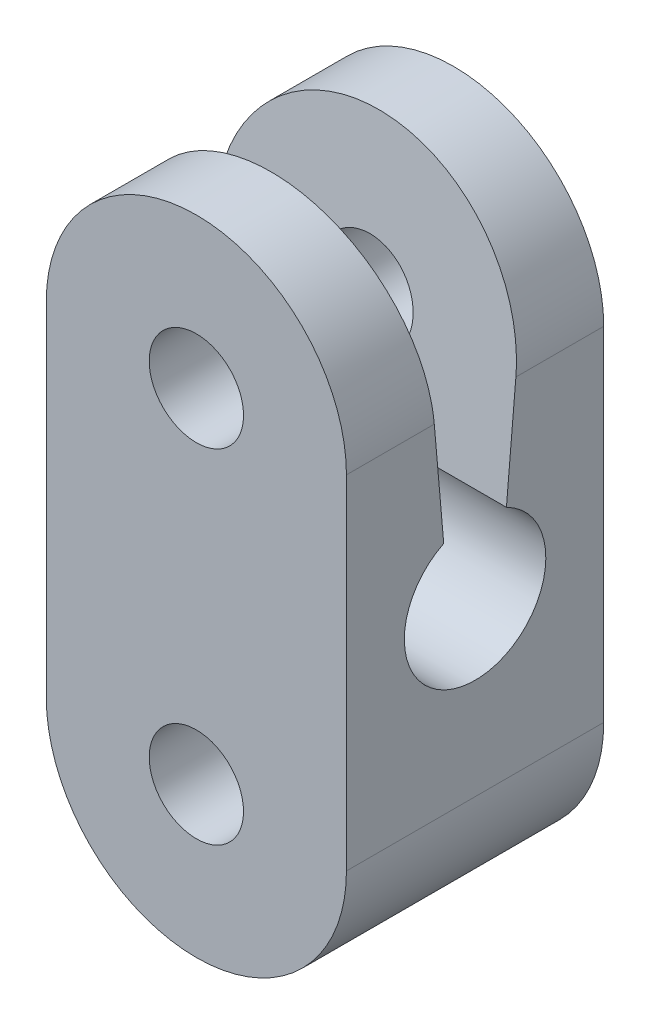
ISO-10303-21;
HEADER;
FILE_DESCRIPTION(('STEP AP214'),'2;1');
FILE_NAME('part.step','',(''),(''),'','','');
FILE_SCHEMA(('AUTOMOTIVE_DESIGN { 1 0 10303 214 1 1 1 1 }'));
ENDSEC;
DATA;
#1=APPLICATION_CONTEXT('core data for automotive mechanical design processes');
#2=APPLICATION_PROTOCOL_DEFINITION('international standard','automotive_design',2000,#1);
#3=PRODUCT_CONTEXT('',#1,'mechanical');
#4=PRODUCT('Part','Part','',(#3));
#5=PRODUCT_RELATED_PRODUCT_CATEGORY('part','',(#4));
#6=PRODUCT_DEFINITION_FORMATION('','',#4);
#7=PRODUCT_DEFINITION_CONTEXT('part definition',#1,'design');
#8=PRODUCT_DEFINITION('design','',#6,#7);
#9=PRODUCT_DEFINITION_SHAPE('','',#8);
#10=(LENGTH_UNIT() NAMED_UNIT(*) SI_UNIT(.MILLI.,.METRE.));
#11=(NAMED_UNIT(*) PLANE_ANGLE_UNIT() SI_UNIT($,.RADIAN.));
#12=(NAMED_UNIT(*) SI_UNIT($,.STERADIAN.) SOLID_ANGLE_UNIT());
#13=UNCERTAINTY_MEASURE_WITH_UNIT(LENGTH_MEASURE(1.E-05),#10,'distance_accuracy_value','');
#14=(GEOMETRIC_REPRESENTATION_CONTEXT(3) GLOBAL_UNCERTAINTY_ASSIGNED_CONTEXT((#13)) GLOBAL_UNIT_ASSIGNED_CONTEXT((#10,
#11,#12)) REPRESENTATION_CONTEXT('',''));
#15=CARTESIAN_POINT('',(0.,0.,0.));
#16=DIRECTION('',(0.,0.,1.));
#17=DIRECTION('',(1.,0.,0.));
#18=AXIS2_PLACEMENT_3D('',#15,#16,#17);
#19=CARTESIAN_POINT('',(0.,4.,3.));
#20=DIRECTION('',(0.,0.,-1.));
#21=DIRECTION('',(-1.,0.,0.));
#22=AXIS2_PLACEMENT_3D('',#19,#20,#21);
#23=CYLINDRICAL_SURFACE('',#22,3.5);
#24=CARTESIAN_POINT('',(0.,4.,0.951517284810414));
#25=DIRECTION('',(0.,0.0871557427476583,-0.996194698091745));
#26=DIRECTION('',(0.,-0.996194698091746,-0.0871557427476584));
#27=AXIS2_PLACEMENT_3D('',#24,#25,#26);
#28=ELLIPSE('',#27,3.51336943140172,3.5);
#29=CARTESIAN_POINT('',(-3.5,4.,0.951517284810413));
#30=VERTEX_POINT('',#29);
#31=CARTESIAN_POINT('',(3.5,4.,0.951517284810414));
#32=VERTEX_POINT('',#31);
#33=EDGE_CURVE('E181',#30,#32,#28,.T.);
#34=ORIENTED_EDGE('',*,*,#33,.F.);
#35=DIRECTION('',(0.,0.,-1.));
#36=VECTOR('',#35,1.);
#37=CARTESIAN_POINT('',(-3.5,4.,3.));
#38=LINE('',#37,#36);
#39=CARTESIAN_POINT('',(-3.5,4.,3.));
#40=VERTEX_POINT('',#39);
#41=EDGE_CURVE('E203',#40,#30,#38,.T.);
#42=ORIENTED_EDGE('',*,*,#41,.F.);
#43=CARTESIAN_POINT('',(0.,4.,3.));
#44=DIRECTION('',(0.,0.,1.));
#45=DIRECTION('',(1.,0.,0.));
#46=AXIS2_PLACEMENT_3D('',#43,#44,#45);
#47=CIRCLE('',#46,3.5);
#48=CARTESIAN_POINT('',(3.5,4.,3.));
#49=VERTEX_POINT('',#48);
#50=EDGE_CURVE('E189',#49,#40,#47,.T.);
#51=ORIENTED_EDGE('',*,*,#50,.F.);
#52=DIRECTION('',(0.,0.,-1.));
#53=VECTOR('',#52,1.);
#54=CARTESIAN_POINT('',(3.5,4.,3.));
#55=LINE('',#54,#53);
#56=EDGE_CURVE('E206',#49,#32,#55,.T.);
#57=ORIENTED_EDGE('',*,*,#56,.T.);
#58=EDGE_LOOP('',(#34,#42,#51,#57));
#59=FACE_BOUND('',#58,.T.);
#60=ADVANCED_FACE('F79',(#59),#23,.T.);
#61=CARTESIAN_POINT('',(0.,-4.,3.));
#62=DIRECTION('',(0.,0.,-1.));
#63=DIRECTION('',(-1.,0.,0.));
#64=AXIS2_PLACEMENT_3D('',#61,#62,#63);
#65=CYLINDRICAL_SURFACE('',#64,3.5);
#66=CARTESIAN_POINT('',(0.,-4.,-3.));
#67=DIRECTION('',(0.,0.,1.));
#68=DIRECTION('',(1.,0.,0.));
#69=AXIS2_PLACEMENT_3D('',#66,#67,#68);
#70=CIRCLE('',#69,3.5);
#71=CARTESIAN_POINT('',(-3.5,-4.,-3.));
#72=VERTEX_POINT('',#71);
#73=CARTESIAN_POINT('',(3.5,-4.,-3.));
#74=VERTEX_POINT('',#73);
#75=EDGE_CURVE('E185',#72,#74,#70,.T.);
#76=ORIENTED_EDGE('',*,*,#75,.T.);
#77=DIRECTION('',(0.,0.,-1.));
#78=VECTOR('',#77,1.);
#79=CARTESIAN_POINT('',(3.5,-4.,3.));
#80=LINE('',#79,#78);
#81=CARTESIAN_POINT('',(3.5,-4.,3.));
#82=VERTEX_POINT('',#81);
#83=EDGE_CURVE('E209',#82,#74,#80,.T.);
#84=ORIENTED_EDGE('',*,*,#83,.F.);
#85=CARTESIAN_POINT('',(0.,-4.,3.));
#86=DIRECTION('',(0.,0.,1.));
#87=DIRECTION('',(1.,0.,0.));
#88=AXIS2_PLACEMENT_3D('',#85,#86,#87);
#89=CIRCLE('',#88,3.5);
#90=CARTESIAN_POINT('',(-3.5,-4.,3.));
#91=VERTEX_POINT('',#90);
#92=EDGE_CURVE('E186',#91,#82,#89,.T.);
#93=ORIENTED_EDGE('',*,*,#92,.F.);
#94=DIRECTION('',(0.,0.,-1.));
#95=VECTOR('',#94,1.);
#96=CARTESIAN_POINT('',(-3.5,-4.,3.));
#97=LINE('',#96,#95);
#98=EDGE_CURVE('E192',#91,#72,#97,.T.);
#99=ORIENTED_EDGE('',*,*,#98,.T.);
#100=EDGE_LOOP('',(#76,#84,#93,#99));
#101=FACE_BOUND('',#100,.T.);
#102=ADVANCED_FACE('F81',(#101),#65,.T.);
#103=CARTESIAN_POINT('',(3.5,-4.,3.));
#104=DIRECTION('',(-1.,0.,0.));
#105=DIRECTION('',(0.,-1.,0.));
#106=AXIS2_PLACEMENT_3D('',#103,#104,#105);
#107=PLANE('',#106);
#108=CARTESIAN_POINT('',(3.5,4.,-0.951517284810414));
#109=VERTEX_POINT('',#108);
#110=CARTESIAN_POINT('',(3.5,4.,-3.));
#111=VERTEX_POINT('',#110);
#112=EDGE_CURVE('E172',#109,#111,#55,.T.);
#113=ORIENTED_EDGE('',*,*,#112,.F.);
#114=DIRECTION('',(0.,0.996194698091746,-0.0871557427476584));
#115=VECTOR('',#114,1.);
#116=CARTESIAN_POINT('',(3.5,-0.0522301272873727,-0.596993086674556));
#117=LINE('',#116,#115);
#118=CARTESIAN_POINT('',(3.5,1.47924589546018,-0.730979877126737));
#119=VERTEX_POINT('',#118);
#120=EDGE_CURVE('E158',#119,#109,#117,.T.);
#121=ORIENTED_EDGE('',*,*,#120,.F.);
#122=CARTESIAN_POINT('',(3.5,0.,0.));
#123=DIRECTION('',(1.,0.,0.));
#124=DIRECTION('',(0.,1.,0.));
#125=AXIS2_PLACEMENT_3D('',#122,#123,#124);
#126=CIRCLE('',#125,1.65);
#127=CARTESIAN_POINT('',(3.5,1.47924589546018,0.730979877126737));
#128=VERTEX_POINT('',#127);
#129=EDGE_CURVE('E162',#128,#119,#126,.T.);
#130=ORIENTED_EDGE('',*,*,#129,.F.);
#131=DIRECTION('',(0.,0.996194698091746,0.0871557427476584));
#132=VECTOR('',#131,1.);
#133=CARTESIAN_POINT('',(3.5,-0.0522301272873727,0.596993086674556));
#134=LINE('',#133,#132);
#135=EDGE_CURVE('E167',#128,#32,#134,.T.);
#136=ORIENTED_EDGE('',*,*,#135,.T.);
#137=ORIENTED_EDGE('',*,*,#56,.F.);
#138=DIRECTION('',(0.,1.,0.));
#139=VECTOR('',#138,1.);
#140=CARTESIAN_POINT('',(3.5,-4.,3.));
#141=LINE('',#140,#139);
#142=EDGE_CURVE('E133',#82,#49,#141,.T.);
#143=ORIENTED_EDGE('',*,*,#142,.F.);
#144=ORIENTED_EDGE('',*,*,#83,.T.);
#145=DIRECTION('',(0.,1.,0.));
#146=VECTOR('',#145,1.);
#147=CARTESIAN_POINT('',(3.5,-4.,-3.));
#148=LINE('',#147,#146);
#149=EDGE_CURVE('E195',#74,#111,#148,.T.);
#150=ORIENTED_EDGE('',*,*,#149,.T.);
#151=EDGE_LOOP('',(#113,#121,#130,#136,#137,#143,#144,#150));
#152=FACE_BOUND('',#151,.T.);
#153=ADVANCED_FACE('F170',(#152),#107,.F.);
#154=CARTESIAN_POINT('',(-3.5,4.,-0.951517284810414));
#155=VERTEX_POINT('',#154);
#156=CARTESIAN_POINT('',(-3.5,4.,-3.));
#157=VERTEX_POINT('',#156);
#158=EDGE_CURVE('E202',#155,#157,#38,.T.);
#159=ORIENTED_EDGE('',*,*,#158,.F.);
#160=CARTESIAN_POINT('',(0.,4.,-0.951517284810414));
#161=DIRECTION('',(0.,-0.0871557427476583,-0.996194698091745));
#162=DIRECTION('',(0.,0.996194698091746,-0.0871557427476584));
#163=AXIS2_PLACEMENT_3D('',#160,#161,#162);
#164=ELLIPSE('',#163,3.51336943140172,3.5);
#165=EDGE_CURVE('E183',#155,#109,#164,.T.);
#166=ORIENTED_EDGE('',*,*,#165,.T.);
#167=ORIENTED_EDGE('',*,*,#112,.T.);
#168=CARTESIAN_POINT('',(0.,4.,-3.));
#169=DIRECTION('',(0.,0.,1.));
#170=DIRECTION('',(1.,0.,0.));
#171=AXIS2_PLACEMENT_3D('',#168,#169,#170);
#172=CIRCLE('',#171,3.5);
#173=EDGE_CURVE('E197',#111,#157,#172,.T.);
#174=ORIENTED_EDGE('',*,*,#173,.T.);
#175=EDGE_LOOP('',(#159,#166,#167,#174));
#176=FACE_BOUND('',#175,.T.);
#177=ADVANCED_FACE('F247',(#176),#23,.T.);
#178=CARTESIAN_POINT('',(-3.5,-4.,3.));
#179=DIRECTION('',(1.,0.,0.));
#180=DIRECTION('',(0.,1.,0.));
#181=AXIS2_PLACEMENT_3D('',#178,#179,#180);
#182=PLANE('',#181);
#183=CARTESIAN_POINT('',(-3.5,0.,0.));
#184=DIRECTION('',(1.,0.,0.));
#185=DIRECTION('',(0.,1.,0.));
#186=AXIS2_PLACEMENT_3D('',#183,#184,#185);
#187=CIRCLE('',#186,1.65);
#188=CARTESIAN_POINT('',(-3.5,1.47924589546018,0.730979877126736));
#189=VERTEX_POINT('',#188);
#190=CARTESIAN_POINT('',(-3.5,1.47924589546018,-0.730979877126737));
#191=VERTEX_POINT('',#190);
#192=EDGE_CURVE('E88',#189,#191,#187,.T.);
#193=ORIENTED_EDGE('',*,*,#192,.T.);
#194=DIRECTION('',(0.,0.996194698091746,-0.0871557427476584));
#195=VECTOR('',#194,1.);
#196=CARTESIAN_POINT('',(-3.5,-4.28231789981219,-0.226908360859006));
#197=LINE('',#196,#195);
#198=EDGE_CURVE('E12',#191,#155,#197,.T.);
#199=ORIENTED_EDGE('',*,*,#198,.T.);
#200=ORIENTED_EDGE('',*,*,#158,.T.);
#201=DIRECTION('',(0.,-1.,0.));
#202=VECTOR('',#201,1.);
#203=CARTESIAN_POINT('',(-3.5,-4.,-3.));
#204=LINE('',#203,#202);
#205=EDGE_CURVE('E125',#157,#72,#204,.T.);
#206=ORIENTED_EDGE('',*,*,#205,.T.);
#207=ORIENTED_EDGE('',*,*,#98,.F.);
#208=DIRECTION('',(0.,-1.,0.));
#209=VECTOR('',#208,1.);
#210=CARTESIAN_POINT('',(-3.5,-4.,3.));
#211=LINE('',#210,#209);
#212=EDGE_CURVE('E105',#40,#91,#211,.T.);
#213=ORIENTED_EDGE('',*,*,#212,.F.);
#214=ORIENTED_EDGE('',*,*,#41,.T.);
#215=DIRECTION('',(0.,0.996194698091746,0.0871557427476584));
#216=VECTOR('',#215,1.);
#217=CARTESIAN_POINT('',(-3.5,-3.76137336681139,0.272485101822382));
#218=LINE('',#217,#216);
#219=EDGE_CURVE('E211',#189,#30,#218,.T.);
#220=ORIENTED_EDGE('',*,*,#219,.F.);
#221=EDGE_LOOP('',(#193,#199,#200,#206,#207,#213,#214,#220));
#222=FACE_BOUND('',#221,.T.);
#223=ADVANCED_FACE('F237',(#222),#182,.F.);
#224=CARTESIAN_POINT('',(0.,-4.,3.));
#225=DIRECTION('',(0.,0.,1.));
#226=DIRECTION('',(1.,0.,0.));
#227=AXIS2_PLACEMENT_3D('',#224,#225,#226);
#228=PLANE('',#227);
#229=CARTESIAN_POINT('',(0.,-4.,3.));
#230=DIRECTION('',(0.,0.,1.));
#231=DIRECTION('',(1.,0.,0.));
#232=AXIS2_PLACEMENT_3D('',#229,#230,#231);
#233=CIRCLE('',#232,1.1);
#234=CARTESIAN_POINT('',(1.1,-4.,3.));
#235=VERTEX_POINT('',#234);
#236=EDGE_CURVE('E225',#235,#235,#233,.T.);
#237=ORIENTED_EDGE('',*,*,#236,.F.);
#238=EDGE_LOOP('',(#237));
#239=FACE_BOUND('',#238,.T.);
#240=CARTESIAN_POINT('',(0.,4.,3.));
#241=DIRECTION('',(0.,0.,1.));
#242=DIRECTION('',(1.,0.,0.));
#243=AXIS2_PLACEMENT_3D('',#240,#241,#242);
#244=CIRCLE('',#243,1.1);
#245=CARTESIAN_POINT('',(1.1,4.,3.));
#246=VERTEX_POINT('',#245);
#247=EDGE_CURVE('E215',#246,#246,#244,.T.);
#248=ORIENTED_EDGE('',*,*,#247,.F.);
#249=EDGE_LOOP('',(#248));
#250=FACE_BOUND('',#249,.T.);
#251=ORIENTED_EDGE('',*,*,#92,.T.);
#252=ORIENTED_EDGE('',*,*,#142,.T.);
#253=ORIENTED_EDGE('',*,*,#50,.T.);
#254=ORIENTED_EDGE('',*,*,#212,.T.);
#255=EDGE_LOOP('',(#251,#252,#253,#254));
#256=FACE_BOUND('',#255,.T.);
#257=ADVANCED_FACE('F233',(#239,#250,#256),#228,.T.);
#258=CARTESIAN_POINT('',(0.,-4.,-3.));
#259=DIRECTION('',(0.,0.,1.));
#260=DIRECTION('',(1.,0.,0.));
#261=AXIS2_PLACEMENT_3D('',#258,#259,#260);
#262=PLANE('',#261);
#263=CARTESIAN_POINT('',(0.,-4.,-3.));
#264=DIRECTION('',(0.,0.,1.));
#265=DIRECTION('',(1.,0.,0.));
#266=AXIS2_PLACEMENT_3D('',#263,#264,#265);
#267=CIRCLE('',#266,1.1);
#268=CARTESIAN_POINT('',(1.1,-4.,-3.));
#269=VERTEX_POINT('',#268);
#270=EDGE_CURVE('E83',#269,#269,#267,.T.);
#271=ORIENTED_EDGE('',*,*,#270,.T.);
#272=EDGE_LOOP('',(#271));
#273=FACE_BOUND('',#272,.T.);
#274=CARTESIAN_POINT('',(0.,4.,-3.));
#275=DIRECTION('',(0.,0.,1.));
#276=DIRECTION('',(1.,0.,0.));
#277=AXIS2_PLACEMENT_3D('',#274,#275,#276);
#278=CIRCLE('',#277,1.1);
#279=CARTESIAN_POINT('',(1.1,4.,-3.));
#280=VERTEX_POINT('',#279);
#281=EDGE_CURVE('E173',#280,#280,#278,.T.);
#282=ORIENTED_EDGE('',*,*,#281,.T.);
#283=EDGE_LOOP('',(#282));
#284=FACE_BOUND('',#283,.T.);
#285=ORIENTED_EDGE('',*,*,#75,.F.);
#286=ORIENTED_EDGE('',*,*,#205,.F.);
#287=ORIENTED_EDGE('',*,*,#173,.F.);
#288=ORIENTED_EDGE('',*,*,#149,.F.);
#289=EDGE_LOOP('',(#285,#286,#287,#288));
#290=FACE_BOUND('',#289,.T.);
#291=ADVANCED_FACE('F236',(#273,#284,#290),#262,.F.);
#292=CARTESIAN_POINT('',(-19.5,0.,0.));
#293=DIRECTION('',(1.,0.,0.));
#294=DIRECTION('',(0.,1.,0.));
#295=AXIS2_PLACEMENT_3D('',#292,#293,#294);
#296=CYLINDRICAL_SURFACE('',#295,1.65);
#297=DIRECTION('',(1.,0.,0.));
#298=VECTOR('',#297,1.);
#299=CARTESIAN_POINT('',(-19.5,1.47924589546017,0.730979877126737));
#300=LINE('',#299,#298);
#301=EDGE_CURVE('E96',#189,#128,#300,.T.);
#302=ORIENTED_EDGE('',*,*,#301,.T.);
#303=ORIENTED_EDGE('',*,*,#129,.T.);
#304=DIRECTION('',(1.,0.,0.));
#305=VECTOR('',#304,1.);
#306=CARTESIAN_POINT('',(-19.5,1.47924589546017,-0.730979877126737));
#307=LINE('',#306,#305);
#308=EDGE_CURVE('E154',#191,#119,#307,.T.);
#309=ORIENTED_EDGE('',*,*,#308,.F.);
#310=ORIENTED_EDGE('',*,*,#192,.F.);
#311=EDGE_LOOP('',(#302,#303,#309,#310));
#312=FACE_BOUND('',#311,.T.);
#313=ADVANCED_FACE('F165',(#312),#296,.F.);
#314=CARTESIAN_POINT('',(-19.5,-0.0522301272873757,-0.596993086674556));
#315=DIRECTION('',(0.,-0.0871557427476583,-0.996194698091745));
#316=DIRECTION('',(0.,0.996194698091746,-0.0871557427476584));
#317=AXIS2_PLACEMENT_3D('',#314,#315,#316);
#318=PLANE('',#317);
#319=CARTESIAN_POINT('',(0.,4.,-0.951517284810417));
#320=DIRECTION('',(0.,-0.0871557427476583,-0.996194698091745));
#321=DIRECTION('',(0.,-0.996194698091746,0.0871557427476584));
#322=AXIS2_PLACEMENT_3D('',#319,#320,#321);
#323=ELLIPSE('',#322,1.10420182129768,1.1);
#324=CARTESIAN_POINT('',(0.,2.9,-0.855279754931901));
#325=VERTEX_POINT('',#324);
#326=EDGE_CURVE('E177',#325,#325,#323,.T.);
#327=ORIENTED_EDGE('',*,*,#326,.T.);
#328=EDGE_LOOP('',(#327));
#329=FACE_BOUND('',#328,.T.);
#330=ORIENTED_EDGE('',*,*,#198,.F.);
#331=ORIENTED_EDGE('',*,*,#308,.T.);
#332=ORIENTED_EDGE('',*,*,#120,.T.);
#333=ORIENTED_EDGE('',*,*,#165,.F.);
#334=EDGE_LOOP('',(#330,#331,#332,#333));
#335=FACE_BOUND('',#334,.T.);
#336=ADVANCED_FACE('F156',(#329,#335),#318,.F.);
#337=CARTESIAN_POINT('',(-19.5,-0.0522301272873757,0.596993086674556));
#338=DIRECTION('',(0.,0.0871557427476583,-0.996194698091745));
#339=DIRECTION('',(0.,0.996194698091746,0.0871557427476584));
#340=AXIS2_PLACEMENT_3D('',#337,#338,#339);
#341=PLANE('',#340);
#342=CARTESIAN_POINT('',(0.,4.,0.951517284810414));
#343=DIRECTION('',(0.,0.0871557427476583,-0.996194698091745));
#344=DIRECTION('',(0.,0.996194698091746,0.0871557427476584));
#345=AXIS2_PLACEMENT_3D('',#342,#343,#344);
#346=ELLIPSE('',#345,1.10420182129768,1.1);
#347=CARTESIAN_POINT('',(0.,5.1,1.04775481468893));
#348=VERTEX_POINT('',#347);
#349=EDGE_CURVE('E213',#348,#348,#346,.T.);
#350=ORIENTED_EDGE('',*,*,#349,.F.);
#351=EDGE_LOOP('',(#350));
#352=FACE_BOUND('',#351,.T.);
#353=ORIENTED_EDGE('',*,*,#33,.T.);
#354=ORIENTED_EDGE('',*,*,#135,.F.);
#355=ORIENTED_EDGE('',*,*,#301,.F.);
#356=ORIENTED_EDGE('',*,*,#219,.T.);
#357=EDGE_LOOP('',(#353,#354,#355,#356));
#358=FACE_BOUND('',#357,.T.);
#359=ADVANCED_FACE('F251',(#352,#358),#341,.T.);
#360=CARTESIAN_POINT('',(0.,4.,-20.));
#361=DIRECTION('',(0.,0.,1.));
#362=DIRECTION('',(1.,0.,0.));
#363=AXIS2_PLACEMENT_3D('',#360,#361,#362);
#364=CYLINDRICAL_SURFACE('',#363,1.1);
#365=ORIENTED_EDGE('',*,*,#349,.T.);
#366=EDGE_LOOP('',(#365));
#367=FACE_BOUND('',#366,.T.);
#368=ORIENTED_EDGE('',*,*,#247,.T.);
#369=EDGE_LOOP('',(#368));
#370=FACE_BOUND('',#369,.T.);
#371=ADVANCED_FACE('F309',(#367,#370),#364,.F.);
#372=ORIENTED_EDGE('',*,*,#326,.F.);
#373=EDGE_LOOP('',(#372));
#374=FACE_BOUND('',#373,.T.);
#375=ORIENTED_EDGE('',*,*,#281,.F.);
#376=EDGE_LOOP('',(#375));
#377=FACE_BOUND('',#376,.T.);
#378=ADVANCED_FACE('F318',(#374,#377),#364,.F.);
#379=CARTESIAN_POINT('',(0.,-4.,-20.));
#380=DIRECTION('',(0.,0.,1.));
#381=DIRECTION('',(1.,0.,0.));
#382=AXIS2_PLACEMENT_3D('',#379,#380,#381);
#383=CYLINDRICAL_SURFACE('',#382,1.1);
#384=ORIENTED_EDGE('',*,*,#236,.T.);
#385=EDGE_LOOP('',(#384));
#386=FACE_BOUND('',#385,.T.);
#387=ORIENTED_EDGE('',*,*,#270,.F.);
#388=EDGE_LOOP('',(#387));
#389=FACE_BOUND('',#388,.T.);
#390=ADVANCED_FACE('F230',(#386,#389),#383,.F.);
#391=CLOSED_SHELL('',(#60,#102,#153,#177,#223,#257,#291,#313,#336,#359,#371,#378,#390));
#392=MANIFOLD_SOLID_BREP('B2',#391);
#393=ADVANCED_BREP_SHAPE_REPRESENTATION('',(#18,#392),#14);
#394=SHAPE_DEFINITION_REPRESENTATION(#9,#393);
ENDSEC;
END-ISO-10303-21;
